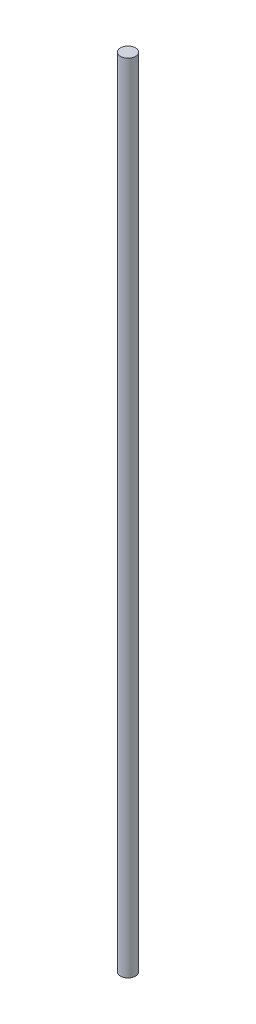
ISO-10303-21;
HEADER;
FILE_DESCRIPTION(('STEP AP214'),'2;1');
FILE_NAME('part.step','',(''),(''),'','','');
FILE_SCHEMA(('AUTOMOTIVE_DESIGN { 1 0 10303 214 1 1 1 1 }'));
ENDSEC;
DATA;
#1=APPLICATION_CONTEXT('core data for automotive mechanical design processes');
#2=APPLICATION_PROTOCOL_DEFINITION('international standard','automotive_design',2000,#1);
#3=PRODUCT_CONTEXT('',#1,'mechanical');
#4=PRODUCT('Part','Part','',(#3));
#5=PRODUCT_RELATED_PRODUCT_CATEGORY('part','',(#4));
#6=PRODUCT_DEFINITION_FORMATION('','',#4);
#7=PRODUCT_DEFINITION_CONTEXT('part definition',#1,'design');
#8=PRODUCT_DEFINITION('design','',#6,#7);
#9=PRODUCT_DEFINITION_SHAPE('','',#8);
#10=(LENGTH_UNIT() NAMED_UNIT(*) SI_UNIT(.MILLI.,.METRE.));
#11=(NAMED_UNIT(*) PLANE_ANGLE_UNIT() SI_UNIT($,.RADIAN.));
#12=(NAMED_UNIT(*) SI_UNIT($,.STERADIAN.) SOLID_ANGLE_UNIT());
#13=UNCERTAINTY_MEASURE_WITH_UNIT(LENGTH_MEASURE(1.E-05),#10,'distance_accuracy_value','');
#14=(GEOMETRIC_REPRESENTATION_CONTEXT(3) GLOBAL_UNCERTAINTY_ASSIGNED_CONTEXT((#13)) GLOBAL_UNIT_ASSIGNED_CONTEXT((#10,
#11,#12)) REPRESENTATION_CONTEXT('',''));
#15=CARTESIAN_POINT('',(0.,0.,0.));
#16=DIRECTION('',(0.,0.,1.));
#17=DIRECTION('',(1.,0.,0.));
#18=AXIS2_PLACEMENT_3D('',#15,#16,#17);
#19=CARTESIAN_POINT('',(0.,80.,0.));
#20=DIRECTION('',(0.,-1.,0.));
#21=DIRECTION('',(0.,0.,-1.));
#22=AXIS2_PLACEMENT_3D('',#19,#20,#21);
#23=CYLINDRICAL_SURFACE('',#22,0.75);
#24=CARTESIAN_POINT('',(0.,80.,0.));
#25=DIRECTION('',(0.,1.,0.));
#26=DIRECTION('',(0.,0.,1.));
#27=AXIS2_PLACEMENT_3D('',#24,#25,#26);
#28=CIRCLE('',#27,0.75);
#29=CARTESIAN_POINT('',(0.,80.,0.75));
#30=VERTEX_POINT('',#29);
#31=EDGE_CURVE('E10',#30,#30,#28,.T.);
#32=ORIENTED_EDGE('',*,*,#31,.F.);
#33=EDGE_LOOP('',(#32));
#34=FACE_BOUND('',#33,.T.);
#35=CARTESIAN_POINT('',(0.,0.,0.));
#36=DIRECTION('',(0.,1.,0.));
#37=DIRECTION('',(0.,0.,1.));
#38=AXIS2_PLACEMENT_3D('',#35,#36,#37);
#39=CIRCLE('',#38,0.75);
#40=CARTESIAN_POINT('',(0.,0.,0.75));
#41=VERTEX_POINT('',#40);
#42=EDGE_CURVE('E40',#41,#41,#39,.T.);
#43=ORIENTED_EDGE('',*,*,#42,.T.);
#44=EDGE_LOOP('',(#43));
#45=FACE_BOUND('',#44,.T.);
#46=ADVANCED_FACE('F37',(#34,#45),#23,.T.);
#47=CARTESIAN_POINT('',(0.,80.,0.));
#48=DIRECTION('',(0.,1.,0.));
#49=DIRECTION('',(0.,0.,1.));
#50=AXIS2_PLACEMENT_3D('',#47,#48,#49);
#51=PLANE('',#50);
#52=ORIENTED_EDGE('',*,*,#31,.T.);
#53=EDGE_LOOP('',(#52));
#54=FACE_BOUND('',#53,.T.);
#55=ADVANCED_FACE('F52',(#54),#51,.T.);
#56=CARTESIAN_POINT('',(0.,0.,0.));
#57=DIRECTION('',(0.,1.,0.));
#58=DIRECTION('',(0.,0.,1.));
#59=AXIS2_PLACEMENT_3D('',#56,#57,#58);
#60=PLANE('',#59);
#61=ORIENTED_EDGE('',*,*,#42,.F.);
#62=EDGE_LOOP('',(#61));
#63=FACE_BOUND('',#62,.T.);
#64=ADVANCED_FACE('F50',(#63),#60,.F.);
#65=CLOSED_SHELL('',(#46,#55,#64));
#66=MANIFOLD_SOLID_BREP('B2',#65);
#67=ADVANCED_BREP_SHAPE_REPRESENTATION('',(#18,#66),#14);
#68=SHAPE_DEFINITION_REPRESENTATION(#9,#67);
ENDSEC;
END-ISO-10303-21;
